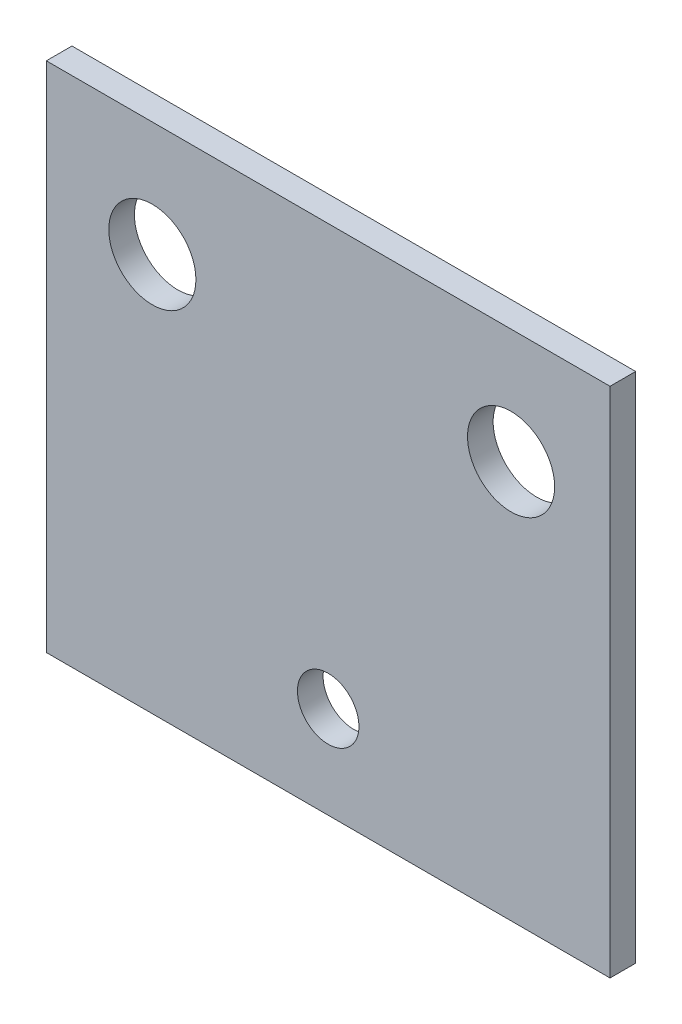
ISO-10303-21;
HEADER;
FILE_DESCRIPTION(('STEP AP214'),'2;1');
FILE_NAME('part.step','',(''),(''),'','','');
FILE_SCHEMA(('AUTOMOTIVE_DESIGN { 1 0 10303 214 1 1 1 1 }'));
ENDSEC;
DATA;
#1=APPLICATION_CONTEXT('core data for automotive mechanical design processes');
#2=APPLICATION_PROTOCOL_DEFINITION('international standard','automotive_design',2000,#1);
#3=PRODUCT_CONTEXT('',#1,'mechanical');
#4=PRODUCT('Part','Part','',(#3));
#5=PRODUCT_RELATED_PRODUCT_CATEGORY('part','',(#4));
#6=PRODUCT_DEFINITION_FORMATION('','',#4);
#7=PRODUCT_DEFINITION_CONTEXT('part definition',#1,'design');
#8=PRODUCT_DEFINITION('design','',#6,#7);
#9=PRODUCT_DEFINITION_SHAPE('','',#8);
#10=(LENGTH_UNIT() NAMED_UNIT(*) SI_UNIT(.MILLI.,.METRE.));
#11=(NAMED_UNIT(*) PLANE_ANGLE_UNIT() SI_UNIT($,.RADIAN.));
#12=(NAMED_UNIT(*) SI_UNIT($,.STERADIAN.) SOLID_ANGLE_UNIT());
#13=UNCERTAINTY_MEASURE_WITH_UNIT(LENGTH_MEASURE(1.E-05),#10,'distance_accuracy_value','');
#14=(GEOMETRIC_REPRESENTATION_CONTEXT(3) GLOBAL_UNCERTAINTY_ASSIGNED_CONTEXT((#13)) GLOBAL_UNIT_ASSIGNED_CONTEXT((#10,
#11,#12)) REPRESENTATION_CONTEXT('',''));
#15=CARTESIAN_POINT('',(0.,0.,0.));
#16=DIRECTION('',(0.,0.,1.));
#17=DIRECTION('',(1.,0.,0.));
#18=AXIS2_PLACEMENT_3D('',#15,#16,#17);
#19=CARTESIAN_POINT('',(0.,0.,5.));
#20=DIRECTION('',(0.,0.,1.));
#21=DIRECTION('',(1.,0.,0.));
#22=AXIS2_PLACEMENT_3D('',#19,#20,#21);
#23=PLANE('',#22);
#24=CARTESIAN_POINT('',(35.6877467609468,27.6040877411891,5.));
#25=DIRECTION('',(0.,0.,1.));
#26=DIRECTION('',(1.,0.,0.));
#27=AXIS2_PLACEMENT_3D('',#24,#25,#26);
#28=CIRCLE('',#27,8.50000000000001);
#29=CARTESIAN_POINT('',(44.1877467609468,27.6040877411891,5.));
#30=VERTEX_POINT('',#29);
#31=EDGE_CURVE('E115',#30,#30,#28,.T.);
#32=ORIENTED_EDGE('',*,*,#31,.F.);
#33=EDGE_LOOP('',(#32));
#34=FACE_BOUND('',#33,.T.);
#35=DIRECTION('',(0.,-1.,0.));
#36=VECTOR('',#35,1.);
#37=CARTESIAN_POINT('',(-55.,-50.,5.));
#38=LINE('',#37,#36);
#39=CARTESIAN_POINT('',(-55.,50.,5.));
#40=VERTEX_POINT('',#39);
#41=CARTESIAN_POINT('',(-55.,-50.,5.));
#42=VERTEX_POINT('',#41);
#43=EDGE_CURVE('E85',#40,#42,#38,.T.);
#44=ORIENTED_EDGE('',*,*,#43,.T.);
#45=DIRECTION('',(1.,0.,0.));
#46=VECTOR('',#45,1.);
#47=CARTESIAN_POINT('',(55.,-50.,5.));
#48=LINE('',#47,#46);
#49=CARTESIAN_POINT('',(55.,-50.,5.));
#50=VERTEX_POINT('',#49);
#51=EDGE_CURVE('E80',#42,#50,#48,.T.);
#52=ORIENTED_EDGE('',*,*,#51,.T.);
#53=DIRECTION('',(0.,1.,0.));
#54=VECTOR('',#53,1.);
#55=CARTESIAN_POINT('',(55.,-50.,5.));
#56=LINE('',#55,#54);
#57=CARTESIAN_POINT('',(55.,50.,5.));
#58=VERTEX_POINT('',#57);
#59=EDGE_CURVE('E83',#50,#58,#56,.T.);
#60=ORIENTED_EDGE('',*,*,#59,.T.);
#61=DIRECTION('',(-1.,0.,0.));
#62=VECTOR('',#61,1.);
#63=CARTESIAN_POINT('',(55.,50.,5.));
#64=LINE('',#63,#62);
#65=EDGE_CURVE('E50',#58,#40,#64,.T.);
#66=ORIENTED_EDGE('',*,*,#65,.T.);
#67=EDGE_LOOP('',(#44,#52,#60,#66));
#68=FACE_BOUND('',#67,.T.);
#69=CARTESIAN_POINT('',(0.,-31.9996540277855,5.));
#70=DIRECTION('',(0.,0.,1.));
#71=DIRECTION('',(1.,0.,0.));
#72=AXIS2_PLACEMENT_3D('',#69,#70,#71);
#73=CIRCLE('',#72,6.);
#74=CARTESIAN_POINT('',(6.,-31.9996540277855,5.));
#75=VERTEX_POINT('',#74);
#76=EDGE_CURVE('E100',#75,#75,#73,.T.);
#77=ORIENTED_EDGE('',*,*,#76,.F.);
#78=EDGE_LOOP('',(#77));
#79=FACE_BOUND('',#78,.T.);
#80=CARTESIAN_POINT('',(-34.3122532390532,27.6040877411891,5.));
#81=DIRECTION('',(0.,0.,1.));
#82=DIRECTION('',(1.,0.,0.));
#83=AXIS2_PLACEMENT_3D('',#80,#81,#82);
#84=CIRCLE('',#83,8.5);
#85=CARTESIAN_POINT('',(-25.8122532390532,27.6040877411891,5.));
#86=VERTEX_POINT('',#85);
#87=EDGE_CURVE('E121',#86,#86,#84,.T.);
#88=ORIENTED_EDGE('',*,*,#87,.F.);
#89=EDGE_LOOP('',(#88));
#90=FACE_BOUND('',#89,.T.);
#91=ADVANCED_FACE('F33',(#34,#68,#79,#90),#23,.T.);
#92=CARTESIAN_POINT('',(0.,0.,0.));
#93=DIRECTION('',(0.,0.,1.));
#94=DIRECTION('',(1.,0.,0.));
#95=AXIS2_PLACEMENT_3D('',#92,#93,#94);
#96=PLANE('',#95);
#97=DIRECTION('',(0.,-1.,0.));
#98=VECTOR('',#97,1.);
#99=CARTESIAN_POINT('',(-55.,-50.,0.));
#100=LINE('',#99,#98);
#101=CARTESIAN_POINT('',(-55.,50.,0.));
#102=VERTEX_POINT('',#101);
#103=CARTESIAN_POINT('',(-55.,-50.,0.));
#104=VERTEX_POINT('',#103);
#105=EDGE_CURVE('E97',#102,#104,#100,.T.);
#106=ORIENTED_EDGE('',*,*,#105,.F.);
#107=DIRECTION('',(-1.,0.,0.));
#108=VECTOR('',#107,1.);
#109=CARTESIAN_POINT('',(55.,50.,0.));
#110=LINE('',#109,#108);
#111=CARTESIAN_POINT('',(55.,50.,0.));
#112=VERTEX_POINT('',#111);
#113=EDGE_CURVE('E73',#112,#102,#110,.T.);
#114=ORIENTED_EDGE('',*,*,#113,.F.);
#115=DIRECTION('',(0.,1.,0.));
#116=VECTOR('',#115,1.);
#117=CARTESIAN_POINT('',(55.,-50.,0.));
#118=LINE('',#117,#116);
#119=CARTESIAN_POINT('',(55.,-50.,0.));
#120=VERTEX_POINT('',#119);
#121=EDGE_CURVE('E67',#120,#112,#118,.T.);
#122=ORIENTED_EDGE('',*,*,#121,.F.);
#123=DIRECTION('',(1.,0.,0.));
#124=VECTOR('',#123,1.);
#125=CARTESIAN_POINT('',(55.,-50.,0.));
#126=LINE('',#125,#124);
#127=EDGE_CURVE('E89',#104,#120,#126,.T.);
#128=ORIENTED_EDGE('',*,*,#127,.F.);
#129=EDGE_LOOP('',(#106,#114,#122,#128));
#130=FACE_BOUND('',#129,.T.);
#131=CARTESIAN_POINT('',(0.,-31.9996540277855,0.));
#132=DIRECTION('',(0.,0.,1.));
#133=DIRECTION('',(1.,0.,0.));
#134=AXIS2_PLACEMENT_3D('',#131,#132,#133);
#135=CIRCLE('',#134,6.);
#136=CARTESIAN_POINT('',(6.,-31.9996540277855,0.));
#137=VERTEX_POINT('',#136);
#138=EDGE_CURVE('E112',#137,#137,#135,.T.);
#139=ORIENTED_EDGE('',*,*,#138,.T.);
#140=EDGE_LOOP('',(#139));
#141=FACE_BOUND('',#140,.T.);
#142=CARTESIAN_POINT('',(35.6877467609468,27.6040877411891,0.));
#143=DIRECTION('',(0.,0.,1.));
#144=DIRECTION('',(1.,0.,0.));
#145=AXIS2_PLACEMENT_3D('',#142,#143,#144);
#146=CIRCLE('',#145,8.50000000000001);
#147=CARTESIAN_POINT('',(44.1877467609468,27.6040877411891,0.));
#148=VERTEX_POINT('',#147);
#149=EDGE_CURVE('E118',#148,#148,#146,.T.);
#150=ORIENTED_EDGE('',*,*,#149,.T.);
#151=EDGE_LOOP('',(#150));
#152=FACE_BOUND('',#151,.T.);
#153=CARTESIAN_POINT('',(-34.3122532390532,27.6040877411891,0.));
#154=DIRECTION('',(0.,0.,1.));
#155=DIRECTION('',(1.,0.,0.));
#156=AXIS2_PLACEMENT_3D('',#153,#154,#155);
#157=CIRCLE('',#156,8.5);
#158=CARTESIAN_POINT('',(-25.8122532390532,27.6040877411891,0.));
#159=VERTEX_POINT('',#158);
#160=EDGE_CURVE('E124',#159,#159,#157,.T.);
#161=ORIENTED_EDGE('',*,*,#160,.T.);
#162=EDGE_LOOP('',(#161));
#163=FACE_BOUND('',#162,.T.);
#164=ADVANCED_FACE('F108',(#130,#141,#152,#163),#96,.F.);
#165=CARTESIAN_POINT('',(-55.,-50.,5.));
#166=DIRECTION('',(1.,0.,0.));
#167=DIRECTION('',(0.,0.,-1.));
#168=AXIS2_PLACEMENT_3D('',#165,#166,#167);
#169=PLANE('',#168);
#170=ORIENTED_EDGE('',*,*,#105,.T.);
#171=DIRECTION('',(0.,0.,-1.));
#172=VECTOR('',#171,1.);
#173=CARTESIAN_POINT('',(-55.,-50.,5.));
#174=LINE('',#173,#172);
#175=EDGE_CURVE('E11',#42,#104,#174,.T.);
#176=ORIENTED_EDGE('',*,*,#175,.F.);
#177=ORIENTED_EDGE('',*,*,#43,.F.);
#178=DIRECTION('',(0.,0.,-1.));
#179=VECTOR('',#178,1.);
#180=CARTESIAN_POINT('',(-55.,50.,5.));
#181=LINE('',#180,#179);
#182=EDGE_CURVE('E93',#40,#102,#181,.T.);
#183=ORIENTED_EDGE('',*,*,#182,.T.);
#184=EDGE_LOOP('',(#170,#176,#177,#183));
#185=FACE_BOUND('',#184,.T.);
#186=ADVANCED_FACE('F35',(#185),#169,.F.);
#187=CARTESIAN_POINT('',(55.,-50.,5.));
#188=DIRECTION('',(0.,1.,0.));
#189=DIRECTION('',(-1.,0.,0.));
#190=AXIS2_PLACEMENT_3D('',#187,#188,#189);
#191=PLANE('',#190);
#192=ORIENTED_EDGE('',*,*,#127,.T.);
#193=DIRECTION('',(0.,0.,-1.));
#194=VECTOR('',#193,1.);
#195=CARTESIAN_POINT('',(55.,-50.,5.));
#196=LINE('',#195,#194);
#197=EDGE_CURVE('E42',#50,#120,#196,.T.);
#198=ORIENTED_EDGE('',*,*,#197,.F.);
#199=ORIENTED_EDGE('',*,*,#51,.F.);
#200=ORIENTED_EDGE('',*,*,#175,.T.);
#201=EDGE_LOOP('',(#192,#198,#199,#200));
#202=FACE_BOUND('',#201,.T.);
#203=ADVANCED_FACE('F88',(#202),#191,.F.);
#204=CARTESIAN_POINT('',(55.,-50.,5.));
#205=DIRECTION('',(-1.,0.,0.));
#206=DIRECTION('',(0.,-1.,0.));
#207=AXIS2_PLACEMENT_3D('',#204,#205,#206);
#208=PLANE('',#207);
#209=ORIENTED_EDGE('',*,*,#121,.T.);
#210=DIRECTION('',(0.,0.,-1.));
#211=VECTOR('',#210,1.);
#212=CARTESIAN_POINT('',(55.,50.,5.));
#213=LINE('',#212,#211);
#214=EDGE_CURVE('E90',#58,#112,#213,.T.);
#215=ORIENTED_EDGE('',*,*,#214,.F.);
#216=ORIENTED_EDGE('',*,*,#59,.F.);
#217=ORIENTED_EDGE('',*,*,#197,.T.);
#218=EDGE_LOOP('',(#209,#215,#216,#217));
#219=FACE_BOUND('',#218,.T.);
#220=ADVANCED_FACE('F91',(#219),#208,.F.);
#221=CARTESIAN_POINT('',(55.,50.,5.));
#222=DIRECTION('',(0.,-1.,0.));
#223=DIRECTION('',(1.,0.,0.));
#224=AXIS2_PLACEMENT_3D('',#221,#222,#223);
#225=PLANE('',#224);
#226=ORIENTED_EDGE('',*,*,#113,.T.);
#227=ORIENTED_EDGE('',*,*,#182,.F.);
#228=ORIENTED_EDGE('',*,*,#65,.F.);
#229=ORIENTED_EDGE('',*,*,#214,.T.);
#230=EDGE_LOOP('',(#226,#227,#228,#229));
#231=FACE_BOUND('',#230,.T.);
#232=ADVANCED_FACE('F105',(#231),#225,.F.);
#233=CARTESIAN_POINT('',(0.,-31.9996540277855,5.));
#234=DIRECTION('',(0.,0.,-1.));
#235=DIRECTION('',(-1.,0.,0.));
#236=AXIS2_PLACEMENT_3D('',#233,#234,#235);
#237=CYLINDRICAL_SURFACE('',#236,6.);
#238=ORIENTED_EDGE('',*,*,#76,.T.);
#239=EDGE_LOOP('',(#238));
#240=FACE_BOUND('',#239,.T.);
#241=ORIENTED_EDGE('',*,*,#138,.F.);
#242=EDGE_LOOP('',(#241));
#243=FACE_BOUND('',#242,.T.);
#244=ADVANCED_FACE('F142',(#240,#243),#237,.F.);
#245=CARTESIAN_POINT('',(35.6877467609468,27.6040877411891,5.));
#246=DIRECTION('',(0.,0.,-1.));
#247=DIRECTION('',(-1.,0.,0.));
#248=AXIS2_PLACEMENT_3D('',#245,#246,#247);
#249=CYLINDRICAL_SURFACE('',#248,8.50000000000001);
#250=ORIENTED_EDGE('',*,*,#31,.T.);
#251=EDGE_LOOP('',(#250));
#252=FACE_BOUND('',#251,.T.);
#253=ORIENTED_EDGE('',*,*,#149,.F.);
#254=EDGE_LOOP('',(#253));
#255=FACE_BOUND('',#254,.T.);
#256=ADVANCED_FACE('F188',(#252,#255),#249,.F.);
#257=CARTESIAN_POINT('',(-34.3122532390532,27.6040877411891,5.));
#258=DIRECTION('',(0.,0.,-1.));
#259=DIRECTION('',(-1.,0.,0.));
#260=AXIS2_PLACEMENT_3D('',#257,#258,#259);
#261=CYLINDRICAL_SURFACE('',#260,8.5);
#262=ORIENTED_EDGE('',*,*,#87,.T.);
#263=EDGE_LOOP('',(#262));
#264=FACE_BOUND('',#263,.T.);
#265=ORIENTED_EDGE('',*,*,#160,.F.);
#266=EDGE_LOOP('',(#265));
#267=FACE_BOUND('',#266,.T.);
#268=ADVANCED_FACE('F130',(#264,#267),#261,.F.);
#269=CLOSED_SHELL('',(#91,#164,#186,#203,#220,#232,#244,#256,#268));
#270=MANIFOLD_SOLID_BREP('B2',#269);
#271=ADVANCED_BREP_SHAPE_REPRESENTATION('',(#18,#270),#14);
#272=SHAPE_DEFINITION_REPRESENTATION(#9,#271);
ENDSEC;
END-ISO-10303-21;
